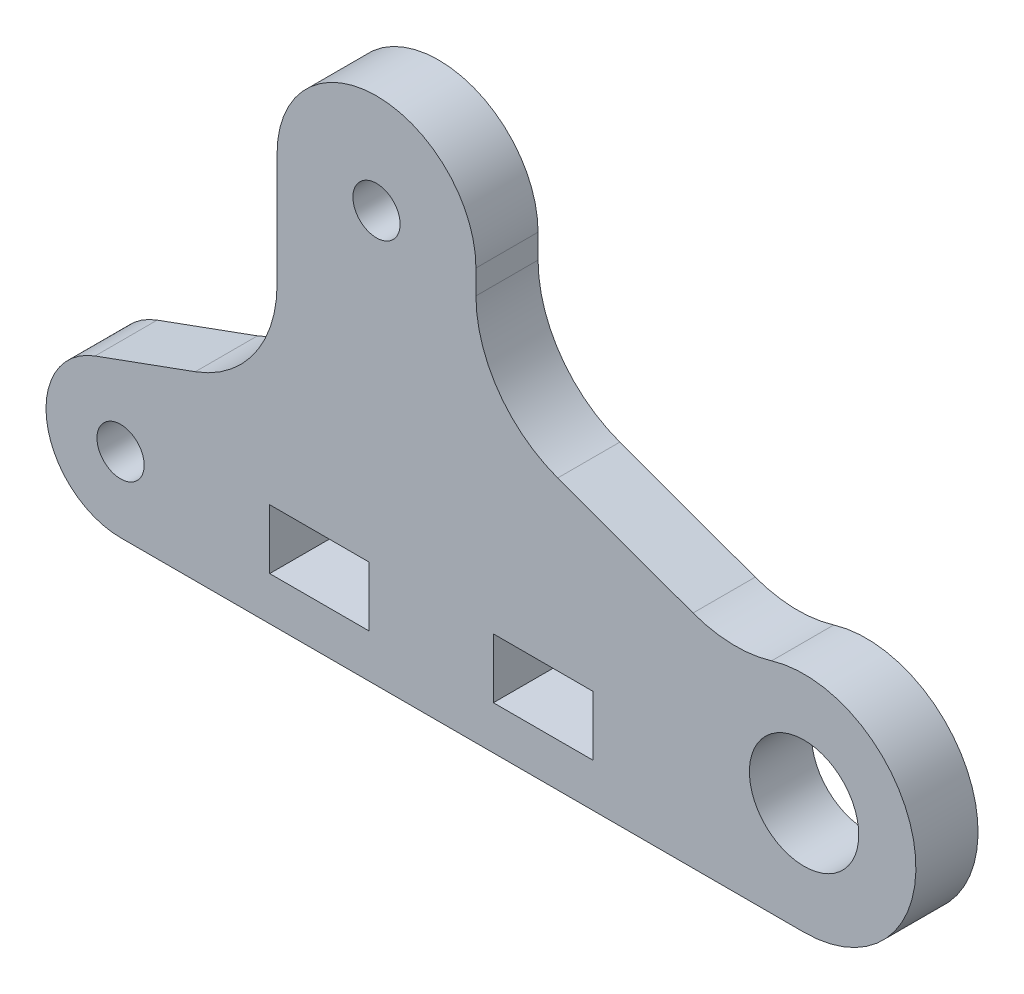
ISO-10303-21;
HEADER;
FILE_DESCRIPTION(('STEP AP214'),'2;1');
FILE_NAME('part.step','',(''),(''),'','','');
FILE_SCHEMA(('AUTOMOTIVE_DESIGN { 1 0 10303 214 1 1 1 1 }'));
ENDSEC;
DATA;
#1=APPLICATION_CONTEXT('core data for automotive mechanical design processes');
#2=APPLICATION_PROTOCOL_DEFINITION('international standard','automotive_design',2000,#1);
#3=PRODUCT_CONTEXT('',#1,'mechanical');
#4=PRODUCT('Part','Part','',(#3));
#5=PRODUCT_RELATED_PRODUCT_CATEGORY('part','',(#4));
#6=PRODUCT_DEFINITION_FORMATION('','',#4);
#7=PRODUCT_DEFINITION_CONTEXT('part definition',#1,'design');
#8=PRODUCT_DEFINITION('design','',#6,#7);
#9=PRODUCT_DEFINITION_SHAPE('','',#8);
#10=(LENGTH_UNIT() NAMED_UNIT(*) SI_UNIT(.MILLI.,.METRE.));
#11=(NAMED_UNIT(*) PLANE_ANGLE_UNIT() SI_UNIT($,.RADIAN.));
#12=(NAMED_UNIT(*) SI_UNIT($,.STERADIAN.) SOLID_ANGLE_UNIT());
#13=UNCERTAINTY_MEASURE_WITH_UNIT(LENGTH_MEASURE(1.E-05),#10,'distance_accuracy_value','');
#14=(GEOMETRIC_REPRESENTATION_CONTEXT(3) GLOBAL_UNCERTAINTY_ASSIGNED_CONTEXT((#13)) GLOBAL_UNIT_ASSIGNED_CONTEXT((#10,
#11,#12)) REPRESENTATION_CONTEXT('',''));
#15=CARTESIAN_POINT('',(0.,0.,0.));
#16=DIRECTION('',(0.,0.,1.));
#17=DIRECTION('',(1.,0.,0.));
#18=AXIS2_PLACEMENT_3D('',#15,#16,#17);
#19=CARTESIAN_POINT('',(-55.,-3.00000000000001,5.));
#20=DIRECTION('',(0.,0.,1.));
#21=DIRECTION('',(1.,0.,0.));
#22=AXIS2_PLACEMENT_3D('',#19,#20,#21);
#23=PLANE('',#22);
#24=CARTESIAN_POINT('',(-52.4043858601376,14.971570646165,5.));
#25=DIRECTION('',(0.,0.,1.));
#26=DIRECTION('',(1.,0.,0.));
#27=AXIS2_PLACEMENT_3D('',#24,#25,#26);
#28=CIRCLE('',#27,10.);
#29=CARTESIAN_POINT('',(-42.4043858601376,14.971570646165,5.));
#30=VERTEX_POINT('',#29);
#31=CARTESIAN_POINT('',(-48.9841844268809,5.57464443830594,5.));
#32=VERTEX_POINT('',#31);
#33=EDGE_CURVE('E218',#30,#32,#28,.F.);
#34=ORIENTED_EDGE('',*,*,#33,.T.);
#35=DIRECTION('',(0.939692620785907,0.342020143325673,0.));
#36=VECTOR('',#35,1.);
#37=CARTESIAN_POINT('',(-57.052120859954,2.63815572471544,5.));
#38=LINE('',#37,#36);
#39=CARTESIAN_POINT('',(-57.052120859954,2.63815572471543,5.));
#40=VERTEX_POINT('',#39);
#41=EDGE_CURVE('E168',#32,#40,#38,.F.);
#42=ORIENTED_EDGE('',*,*,#41,.T.);
#43=CARTESIAN_POINT('',(-55.,-3.00000000000001,5.));
#44=DIRECTION('',(0.,0.,-1.));
#45=DIRECTION('',(-1.,0.,0.));
#46=AXIS2_PLACEMENT_3D('',#43,#44,#45);
#47=CIRCLE('',#46,6.);
#48=CARTESIAN_POINT('',(-55.,-9.00000000000001,5.));
#49=VERTEX_POINT('',#48);
#50=EDGE_CURVE('E108',#49,#40,#47,.T.);
#51=ORIENTED_EDGE('',*,*,#50,.F.);
#52=DIRECTION('',(-1.,0.,0.));
#53=VECTOR('',#52,1.);
#54=CARTESIAN_POINT('',(0.,-9.,5.));
#55=LINE('',#54,#53);
#56=CARTESIAN_POINT('',(0.,-9.,5.));
#57=VERTEX_POINT('',#56);
#58=EDGE_CURVE('E184',#49,#57,#55,.F.);
#59=ORIENTED_EDGE('',*,*,#58,.T.);
#60=CARTESIAN_POINT('',(0.,0.,5.));
#61=DIRECTION('',(0.,0.,-1.));
#62=DIRECTION('',(-1.,0.,0.));
#63=AXIS2_PLACEMENT_3D('',#60,#61,#62);
#64=CIRCLE('',#63,9.);
#65=CARTESIAN_POINT('',(-2.61173540827363,8.61271375102933,5.));
#66=VERTEX_POINT('',#65);
#67=EDGE_CURVE('E102',#66,#57,#64,.T.);
#68=ORIENTED_EDGE('',*,*,#67,.F.);
#69=CARTESIAN_POINT('',(-5.51366363968878,18.1823956966175,5.));
#70=DIRECTION('',(0.,0.,-1.));
#71=DIRECTION('',(-1.,0.,0.));
#72=AXIS2_PLACEMENT_3D('',#69,#70,#71);
#73=CIRCLE('',#72,10.);
#74=CARTESIAN_POINT('',(-8.93386507294544,8.78546948875838,5.));
#75=VERTEX_POINT('',#74);
#76=EDGE_CURVE('E224',#66,#75,#73,.T.);
#77=ORIENTED_EDGE('',*,*,#76,.T.);
#78=DIRECTION('',(0.93969262078591,-0.342020143325666,0.));
#79=VECTOR('',#78,1.);
#80=CARTESIAN_POINT('',(-26.4043858601376,15.1442190324252,5.));
#81=LINE('',#80,#79);
#82=CARTESIAN_POINT('',(-19.8245872933943,12.7493682066632,5.));
#83=VERTEX_POINT('',#82);
#84=EDGE_CURVE('E180',#75,#83,#81,.F.);
#85=ORIENTED_EDGE('',*,*,#84,.T.);
#86=CARTESIAN_POINT('',(-16.4043858601376,22.1462944145223,5.));
#87=DIRECTION('',(0.,0.,1.));
#88=DIRECTION('',(1.,0.,0.));
#89=AXIS2_PLACEMENT_3D('',#86,#87,#88);
#90=CIRCLE('',#89,10.);
#91=CARTESIAN_POINT('',(-26.4043858601376,22.1462944145223,5.));
#92=VERTEX_POINT('',#91);
#93=EDGE_CURVE('E222',#83,#92,#90,.F.);
#94=ORIENTED_EDGE('',*,*,#93,.T.);
#95=DIRECTION('',(0.,1.,0.));
#96=VECTOR('',#95,1.);
#97=CARTESIAN_POINT('',(-26.4043858601376,24.090210326744,5.));
#98=LINE('',#97,#96);
#99=CARTESIAN_POINT('',(-26.4043858601376,24.090210326744,5.));
#100=VERTEX_POINT('',#99);
#101=EDGE_CURVE('E175',#92,#100,#98,.T.);
#102=ORIENTED_EDGE('',*,*,#101,.T.);
#103=CARTESIAN_POINT('',(-34.4043858601376,24.090210326744,5.));
#104=DIRECTION('',(0.,0.,-1.));
#105=DIRECTION('',(-1.,0.,0.));
#106=AXIS2_PLACEMENT_3D('',#103,#104,#105);
#107=CIRCLE('',#106,8.);
#108=CARTESIAN_POINT('',(-42.4043858601376,24.090210326744,5.));
#109=VERTEX_POINT('',#108);
#110=EDGE_CURVE('E178',#109,#100,#107,.T.);
#111=ORIENTED_EDGE('',*,*,#110,.F.);
#112=DIRECTION('',(0.,1.,0.));
#113=VECTOR('',#112,1.);
#114=CARTESIAN_POINT('',(-42.4043858601376,24.090210326744,5.));
#115=LINE('',#114,#113);
#116=EDGE_CURVE('E171',#109,#30,#115,.F.);
#117=ORIENTED_EDGE('',*,*,#116,.T.);
#118=EDGE_LOOP('',(#34,#42,#51,#59,#68,#77,#85,#94,#102,#111,#117));
#119=FACE_BOUND('',#118,.T.);
#120=CARTESIAN_POINT('',(-34.4043858601376,24.090210326744,5.));
#121=DIRECTION('',(0.,0.,1.));
#122=DIRECTION('',(1.,0.,0.));
#123=AXIS2_PLACEMENT_3D('',#120,#121,#122);
#124=CIRCLE('',#123,1.9);
#125=CARTESIAN_POINT('',(-32.5043858601376,24.090210326744,5.));
#126=VERTEX_POINT('',#125);
#127=EDGE_CURVE('E229',#126,#126,#124,.F.);
#128=ORIENTED_EDGE('',*,*,#127,.T.);
#129=EDGE_LOOP('',(#128));
#130=FACE_BOUND('',#129,.T.);
#131=CARTESIAN_POINT('',(-55.,-3.00000000000001,5.));
#132=DIRECTION('',(0.,0.,1.));
#133=DIRECTION('',(1.,0.,0.));
#134=AXIS2_PLACEMENT_3D('',#131,#132,#133);
#135=CIRCLE('',#134,1.9);
#136=CARTESIAN_POINT('',(-53.1,-3.00000000000001,5.));
#137=VERTEX_POINT('',#136);
#138=EDGE_CURVE('E231',#137,#137,#135,.F.);
#139=ORIENTED_EDGE('',*,*,#138,.T.);
#140=EDGE_LOOP('',(#139));
#141=FACE_BOUND('',#140,.T.);
#142=CARTESIAN_POINT('',(0.,0.,5.));
#143=DIRECTION('',(0.,0.,1.));
#144=DIRECTION('',(1.,0.,0.));
#145=AXIS2_PLACEMENT_3D('',#142,#143,#144);
#146=CIRCLE('',#145,4.4);
#147=CARTESIAN_POINT('',(4.4,0.,5.));
#148=VERTEX_POINT('',#147);
#149=EDGE_CURVE('E20',#148,#148,#146,.F.);
#150=ORIENTED_EDGE('',*,*,#149,.T.);
#151=EDGE_LOOP('',(#150));
#152=FACE_BOUND('',#151,.T.);
#153=DIRECTION('',(0.,1.,0.));
#154=VECTOR('',#153,1.);
#155=CARTESIAN_POINT('',(-17.,-0.700000000000009,5.));
#156=LINE('',#155,#154);
#157=CARTESIAN_POINT('',(-17.,-0.700000000000009,5.));
#158=VERTEX_POINT('',#157);
#159=CARTESIAN_POINT('',(-17.,-5.50000000000001,5.));
#160=VERTEX_POINT('',#159);
#161=EDGE_CURVE('E258',#158,#160,#156,.F.);
#162=ORIENTED_EDGE('',*,*,#161,.T.);
#163=DIRECTION('',(1.,0.,0.));
#164=VECTOR('',#163,1.);
#165=CARTESIAN_POINT('',(-43.,-5.50000000000001,5.));
#166=LINE('',#165,#164);
#167=CARTESIAN_POINT('',(-25.,-5.50000000000001,5.));
#168=VERTEX_POINT('',#167);
#169=EDGE_CURVE('E253',#160,#168,#166,.F.);
#170=ORIENTED_EDGE('',*,*,#169,.T.);
#171=DIRECTION('',(0.,1.,0.));
#172=VECTOR('',#171,1.);
#173=CARTESIAN_POINT('',(-25.,-0.700000000000009,5.));
#174=LINE('',#173,#172);
#175=CARTESIAN_POINT('',(-25.,-0.700000000000009,5.));
#176=VERTEX_POINT('',#175);
#177=EDGE_CURVE('E117',#176,#168,#174,.F.);
#178=ORIENTED_EDGE('',*,*,#177,.F.);
#179=DIRECTION('',(1.,0.,0.));
#180=VECTOR('',#179,1.);
#181=CARTESIAN_POINT('',(-43.,-0.700000000000009,5.));
#182=LINE('',#181,#180);
#183=EDGE_CURVE('E236',#176,#158,#182,.T.);
#184=ORIENTED_EDGE('',*,*,#183,.T.);
#185=EDGE_LOOP('',(#162,#170,#178,#184));
#186=FACE_BOUND('',#185,.T.);
#187=DIRECTION('',(1.,0.,0.));
#188=VECTOR('',#187,1.);
#189=CARTESIAN_POINT('',(-43.,-5.50000000000001,5.));
#190=LINE('',#189,#188);
#191=CARTESIAN_POINT('',(-35.,-5.50000000000001,5.));
#192=VERTEX_POINT('',#191);
#193=CARTESIAN_POINT('',(-43.,-5.50000000000001,5.));
#194=VERTEX_POINT('',#193);
#195=EDGE_CURVE('E144',#192,#194,#190,.F.);
#196=ORIENTED_EDGE('',*,*,#195,.T.);
#197=DIRECTION('',(0.,1.,0.));
#198=VECTOR('',#197,1.);
#199=CARTESIAN_POINT('',(-43.,-0.700000000000009,5.));
#200=LINE('',#199,#198);
#201=CARTESIAN_POINT('',(-43.,-0.700000000000009,5.));
#202=VERTEX_POINT('',#201);
#203=EDGE_CURVE('E141',#194,#202,#200,.T.);
#204=ORIENTED_EDGE('',*,*,#203,.T.);
#205=DIRECTION('',(1.,0.,0.));
#206=VECTOR('',#205,1.);
#207=CARTESIAN_POINT('',(-43.,-0.700000000000009,5.));
#208=LINE('',#207,#206);
#209=CARTESIAN_POINT('',(-35.,-0.700000000000009,5.));
#210=VERTEX_POINT('',#209);
#211=EDGE_CURVE('E266',#202,#210,#208,.T.);
#212=ORIENTED_EDGE('',*,*,#211,.T.);
#213=DIRECTION('',(0.,1.,0.));
#214=VECTOR('',#213,1.);
#215=CARTESIAN_POINT('',(-35.,-0.700000000000009,5.));
#216=LINE('',#215,#214);
#217=EDGE_CURVE('E145',#192,#210,#216,.T.);
#218=ORIENTED_EDGE('',*,*,#217,.F.);
#219=EDGE_LOOP('',(#196,#204,#212,#218));
#220=FACE_BOUND('',#219,.T.);
#221=ADVANCED_FACE('F17',(#119,#130,#141,#152,#186,#220),#23,.T.);
#222=CARTESIAN_POINT('',(-43.,-5.50000000000001,-3.));
#223=DIRECTION('',(0.,-1.,0.));
#224=DIRECTION('',(0.,0.,-1.));
#225=AXIS2_PLACEMENT_3D('',#222,#223,#224);
#226=PLANE('',#225);
#227=DIRECTION('',(0.,0.,1.));
#228=VECTOR('',#227,1.);
#229=CARTESIAN_POINT('',(-35.,-5.50000000000001,0.));
#230=LINE('',#229,#228);
#231=CARTESIAN_POINT('',(-35.,-5.50000000000001,0.));
#232=VERTEX_POINT('',#231);
#233=EDGE_CURVE('E260',#232,#192,#230,.T.);
#234=ORIENTED_EDGE('',*,*,#233,.F.);
#235=DIRECTION('',(1.,0.,0.));
#236=VECTOR('',#235,1.);
#237=CARTESIAN_POINT('',(-55.,-5.50000000000001,0.));
#238=LINE('',#237,#236);
#239=CARTESIAN_POINT('',(-43.,-5.50000000000001,0.));
#240=VERTEX_POINT('',#239);
#241=EDGE_CURVE('E164',#232,#240,#238,.F.);
#242=ORIENTED_EDGE('',*,*,#241,.T.);
#243=DIRECTION('',(0.,0.,1.));
#244=VECTOR('',#243,1.);
#245=CARTESIAN_POINT('',(-43.,-5.50000000000001,-3.));
#246=LINE('',#245,#244);
#247=EDGE_CURVE('E150',#240,#194,#246,.T.);
#248=ORIENTED_EDGE('',*,*,#247,.T.);
#249=ORIENTED_EDGE('',*,*,#195,.F.);
#250=EDGE_LOOP('',(#234,#242,#248,#249));
#251=FACE_BOUND('',#250,.T.);
#252=ADVANCED_FACE('F162',(#251),#226,.F.);
#253=CARTESIAN_POINT('',(-43.,-0.700000000000009,-3.));
#254=DIRECTION('',(-1.,0.,0.));
#255=DIRECTION('',(0.,0.,1.));
#256=AXIS2_PLACEMENT_3D('',#253,#254,#255);
#257=PLANE('',#256);
#258=ORIENTED_EDGE('',*,*,#203,.F.);
#259=ORIENTED_EDGE('',*,*,#247,.F.);
#260=DIRECTION('',(0.,1.,0.));
#261=VECTOR('',#260,1.);
#262=CARTESIAN_POINT('',(-43.,-3.00000000000001,0.));
#263=LINE('',#262,#261);
#264=CARTESIAN_POINT('',(-43.,-0.700000000000009,0.));
#265=VERTEX_POINT('',#264);
#266=EDGE_CURVE('E289',#240,#265,#263,.T.);
#267=ORIENTED_EDGE('',*,*,#266,.T.);
#268=DIRECTION('',(0.,0.,1.));
#269=VECTOR('',#268,1.);
#270=CARTESIAN_POINT('',(-43.,-0.700000000000009,-3.));
#271=LINE('',#270,#269);
#272=EDGE_CURVE('E159',#265,#202,#271,.T.);
#273=ORIENTED_EDGE('',*,*,#272,.T.);
#274=EDGE_LOOP('',(#258,#259,#267,#273));
#275=FACE_BOUND('',#274,.T.);
#276=ADVANCED_FACE('F155',(#275),#257,.F.);
#277=CARTESIAN_POINT('',(-43.,-0.700000000000009,-3.));
#278=DIRECTION('',(0.,1.,0.));
#279=DIRECTION('',(0.,0.,1.));
#280=AXIS2_PLACEMENT_3D('',#277,#278,#279);
#281=PLANE('',#280);
#282=DIRECTION('',(0.,0.,1.));
#283=VECTOR('',#282,1.);
#284=CARTESIAN_POINT('',(-35.,-0.700000000000009,0.));
#285=LINE('',#284,#283);
#286=CARTESIAN_POINT('',(-35.,-0.700000000000009,0.));
#287=VERTEX_POINT('',#286);
#288=EDGE_CURVE('E262',#210,#287,#285,.F.);
#289=ORIENTED_EDGE('',*,*,#288,.F.);
#290=ORIENTED_EDGE('',*,*,#211,.F.);
#291=ORIENTED_EDGE('',*,*,#272,.F.);
#292=DIRECTION('',(1.,0.,0.));
#293=VECTOR('',#292,1.);
#294=CARTESIAN_POINT('',(-55.,-0.700000000000009,0.));
#295=LINE('',#294,#293);
#296=EDGE_CURVE('E273',#265,#287,#295,.T.);
#297=ORIENTED_EDGE('',*,*,#296,.T.);
#298=EDGE_LOOP('',(#289,#290,#291,#297));
#299=FACE_BOUND('',#298,.T.);
#300=ADVANCED_FACE('F270',(#299),#281,.F.);
#301=CARTESIAN_POINT('',(-35.,-0.700000000000009,0.));
#302=DIRECTION('',(-1.,0.,0.));
#303=DIRECTION('',(0.,0.,1.));
#304=AXIS2_PLACEMENT_3D('',#301,#302,#303);
#305=PLANE('',#304);
#306=DIRECTION('',(0.,1.,0.));
#307=VECTOR('',#306,1.);
#308=CARTESIAN_POINT('',(-35.,-3.00000000000001,0.));
#309=LINE('',#308,#307);
#310=EDGE_CURVE('E278',#287,#232,#309,.F.);
#311=ORIENTED_EDGE('',*,*,#310,.T.);
#312=ORIENTED_EDGE('',*,*,#233,.T.);
#313=ORIENTED_EDGE('',*,*,#217,.T.);
#314=ORIENTED_EDGE('',*,*,#288,.T.);
#315=EDGE_LOOP('',(#311,#312,#313,#314));
#316=FACE_BOUND('',#315,.T.);
#317=ADVANCED_FACE('F277',(#316),#305,.T.);
#318=CARTESIAN_POINT('',(-17.,-0.700000000000009,-3.));
#319=DIRECTION('',(1.,0.,0.));
#320=DIRECTION('',(0.,0.,-1.));
#321=AXIS2_PLACEMENT_3D('',#318,#319,#320);
#322=PLANE('',#321);
#323=ORIENTED_EDGE('',*,*,#161,.F.);
#324=DIRECTION('',(0.,0.,1.));
#325=VECTOR('',#324,1.);
#326=CARTESIAN_POINT('',(-17.,-0.700000000000009,-3.));
#327=LINE('',#326,#325);
#328=CARTESIAN_POINT('',(-17.,-0.700000000000009,0.));
#329=VERTEX_POINT('',#328);
#330=EDGE_CURVE('E242',#158,#329,#327,.F.);
#331=ORIENTED_EDGE('',*,*,#330,.T.);
#332=DIRECTION('',(0.,1.,0.));
#333=VECTOR('',#332,1.);
#334=CARTESIAN_POINT('',(-17.,-3.00000000000001,0.));
#335=LINE('',#334,#333);
#336=CARTESIAN_POINT('',(-17.,-5.50000000000001,0.));
#337=VERTEX_POINT('',#336);
#338=EDGE_CURVE('E284',#329,#337,#335,.F.);
#339=ORIENTED_EDGE('',*,*,#338,.T.);
#340=DIRECTION('',(0.,0.,-1.));
#341=VECTOR('',#340,1.);
#342=CARTESIAN_POINT('',(-17.,-5.50000000000001,-3.));
#343=LINE('',#342,#341);
#344=EDGE_CURVE('E255',#337,#160,#343,.F.);
#345=ORIENTED_EDGE('',*,*,#344,.T.);
#346=EDGE_LOOP('',(#323,#331,#339,#345));
#347=FACE_BOUND('',#346,.T.);
#348=ADVANCED_FACE('F343',(#347),#322,.F.);
#349=CARTESIAN_POINT('',(-43.,-5.50000000000001,-3.));
#350=DIRECTION('',(0.,-1.,0.));
#351=DIRECTION('',(0.,0.,-1.));
#352=AXIS2_PLACEMENT_3D('',#349,#350,#351);
#353=PLANE('',#352);
#354=DIRECTION('',(0.,0.,-1.));
#355=VECTOR('',#354,1.);
#356=CARTESIAN_POINT('',(-25.,-5.50000000000001,0.));
#357=LINE('',#356,#355);
#358=CARTESIAN_POINT('',(-25.,-5.50000000000001,0.));
#359=VERTEX_POINT('',#358);
#360=EDGE_CURVE('E249',#168,#359,#357,.T.);
#361=ORIENTED_EDGE('',*,*,#360,.F.);
#362=ORIENTED_EDGE('',*,*,#169,.F.);
#363=ORIENTED_EDGE('',*,*,#344,.F.);
#364=DIRECTION('',(1.,0.,0.));
#365=VECTOR('',#364,1.);
#366=CARTESIAN_POINT('',(-55.,-5.50000000000001,0.));
#367=LINE('',#366,#365);
#368=EDGE_CURVE('E287',#337,#359,#367,.F.);
#369=ORIENTED_EDGE('',*,*,#368,.T.);
#370=EDGE_LOOP('',(#361,#362,#363,#369));
#371=FACE_BOUND('',#370,.T.);
#372=ADVANCED_FACE('F333',(#371),#353,.F.);
#373=CARTESIAN_POINT('',(-25.,-0.700000000000009,0.));
#374=DIRECTION('',(1.,0.,0.));
#375=DIRECTION('',(0.,0.,-1.));
#376=AXIS2_PLACEMENT_3D('',#373,#374,#375);
#377=PLANE('',#376);
#378=DIRECTION('',(0.,1.,0.));
#379=VECTOR('',#378,1.);
#380=CARTESIAN_POINT('',(-25.,-3.00000000000001,0.));
#381=LINE('',#380,#379);
#382=CARTESIAN_POINT('',(-25.,-0.700000000000009,0.));
#383=VERTEX_POINT('',#382);
#384=EDGE_CURVE('E325',#359,#383,#381,.T.);
#385=ORIENTED_EDGE('',*,*,#384,.T.);
#386=DIRECTION('',(0.,0.,1.));
#387=VECTOR('',#386,1.);
#388=CARTESIAN_POINT('',(-25.,-0.700000000000009,-3.));
#389=LINE('',#388,#387);
#390=EDGE_CURVE('E239',#383,#176,#389,.T.);
#391=ORIENTED_EDGE('',*,*,#390,.T.);
#392=ORIENTED_EDGE('',*,*,#177,.T.);
#393=ORIENTED_EDGE('',*,*,#360,.T.);
#394=EDGE_LOOP('',(#385,#391,#392,#393));
#395=FACE_BOUND('',#394,.T.);
#396=ADVANCED_FACE('F351',(#395),#377,.T.);
#397=CARTESIAN_POINT('',(-43.,-0.700000000000009,-3.));
#398=DIRECTION('',(0.,1.,0.));
#399=DIRECTION('',(0.,0.,1.));
#400=AXIS2_PLACEMENT_3D('',#397,#398,#399);
#401=PLANE('',#400);
#402=ORIENTED_EDGE('',*,*,#390,.F.);
#403=DIRECTION('',(1.,0.,0.));
#404=VECTOR('',#403,1.);
#405=CARTESIAN_POINT('',(-55.,-0.700000000000009,0.));
#406=LINE('',#405,#404);
#407=EDGE_CURVE('E215',#383,#329,#406,.T.);
#408=ORIENTED_EDGE('',*,*,#407,.T.);
#409=ORIENTED_EDGE('',*,*,#330,.F.);
#410=ORIENTED_EDGE('',*,*,#183,.F.);
#411=EDGE_LOOP('',(#402,#408,#409,#410));
#412=FACE_BOUND('',#411,.T.);
#413=ADVANCED_FACE('F348',(#412),#401,.F.);
#414=CARTESIAN_POINT('',(0.,0.,0.));
#415=DIRECTION('',(0.,0.,1.));
#416=DIRECTION('',(1.,0.,0.));
#417=AXIS2_PLACEMENT_3D('',#414,#415,#416);
#418=CYLINDRICAL_SURFACE('',#417,4.4);
#419=CARTESIAN_POINT('',(0.,0.,0.));
#420=DIRECTION('',(0.,0.,1.));
#421=DIRECTION('',(1.,0.,0.));
#422=AXIS2_PLACEMENT_3D('',#419,#420,#421);
#423=CIRCLE('',#422,4.4);
#424=CARTESIAN_POINT('',(4.4,0.,0.));
#425=VERTEX_POINT('',#424);
#426=EDGE_CURVE('E212',#425,#425,#423,.F.);
#427=ORIENTED_EDGE('',*,*,#426,.T.);
#428=EDGE_LOOP('',(#427));
#429=FACE_BOUND('',#428,.T.);
#430=ORIENTED_EDGE('',*,*,#149,.F.);
#431=EDGE_LOOP('',(#430));
#432=FACE_BOUND('',#431,.T.);
#433=ADVANCED_FACE('F410',(#429,#432),#418,.F.);
#434=CARTESIAN_POINT('',(-55.,-3.00000000000001,0.));
#435=DIRECTION('',(0.,0.,1.));
#436=DIRECTION('',(1.,0.,0.));
#437=AXIS2_PLACEMENT_3D('',#434,#435,#436);
#438=CYLINDRICAL_SURFACE('',#437,1.9);
#439=CARTESIAN_POINT('',(-55.,-3.00000000000001,0.));
#440=DIRECTION('',(0.,0.,1.));
#441=DIRECTION('',(1.,0.,0.));
#442=AXIS2_PLACEMENT_3D('',#439,#440,#441);
#443=CIRCLE('',#442,1.9);
#444=CARTESIAN_POINT('',(-53.1,-3.00000000000001,0.));
#445=VERTEX_POINT('',#444);
#446=EDGE_CURVE('E209',#445,#445,#443,.F.);
#447=ORIENTED_EDGE('',*,*,#446,.T.);
#448=EDGE_LOOP('',(#447));
#449=FACE_BOUND('',#448,.T.);
#450=ORIENTED_EDGE('',*,*,#138,.F.);
#451=EDGE_LOOP('',(#450));
#452=FACE_BOUND('',#451,.T.);
#453=ADVANCED_FACE('F406',(#449,#452),#438,.F.);
#454=CARTESIAN_POINT('',(-34.4043858601376,24.090210326744,0.));
#455=DIRECTION('',(0.,0.,1.));
#456=DIRECTION('',(1.,0.,0.));
#457=AXIS2_PLACEMENT_3D('',#454,#455,#456);
#458=CYLINDRICAL_SURFACE('',#457,1.9);
#459=CARTESIAN_POINT('',(-34.4043858601376,24.090210326744,0.));
#460=DIRECTION('',(0.,0.,1.));
#461=DIRECTION('',(1.,0.,0.));
#462=AXIS2_PLACEMENT_3D('',#459,#460,#461);
#463=CIRCLE('',#462,1.9);
#464=CARTESIAN_POINT('',(-32.5043858601376,24.090210326744,0.));
#465=VERTEX_POINT('',#464);
#466=EDGE_CURVE('E206',#465,#465,#463,.F.);
#467=ORIENTED_EDGE('',*,*,#466,.T.);
#468=EDGE_LOOP('',(#467));
#469=FACE_BOUND('',#468,.T.);
#470=ORIENTED_EDGE('',*,*,#127,.F.);
#471=EDGE_LOOP('',(#470));
#472=FACE_BOUND('',#471,.T.);
#473=ADVANCED_FACE('F403',(#469,#472),#458,.F.);
#474=CARTESIAN_POINT('',(0.,-9.,5.));
#475=DIRECTION('',(0.,1.,0.));
#476=DIRECTION('',(-1.,0.,0.));
#477=AXIS2_PLACEMENT_3D('',#474,#475,#476);
#478=PLANE('',#477);
#479=DIRECTION('',(0.,0.,-1.));
#480=VECTOR('',#479,1.);
#481=CARTESIAN_POINT('',(0.,-9.,5.));
#482=LINE('',#481,#480);
#483=CARTESIAN_POINT('',(0.,-9.00000000000001,0.));
#484=VERTEX_POINT('',#483);
#485=EDGE_CURVE('E228',#57,#484,#482,.T.);
#486=ORIENTED_EDGE('',*,*,#485,.F.);
#487=ORIENTED_EDGE('',*,*,#58,.F.);
#488=DIRECTION('',(0.,0.,1.));
#489=VECTOR('',#488,1.);
#490=CARTESIAN_POINT('',(-55.,-9.00000000000001,5.));
#491=LINE('',#490,#489);
#492=CARTESIAN_POINT('',(-55.,-9.00000000000001,0.));
#493=VERTEX_POINT('',#492);
#494=EDGE_CURVE('E186',#493,#49,#491,.T.);
#495=ORIENTED_EDGE('',*,*,#494,.F.);
#496=DIRECTION('',(1.,0.,0.));
#497=VECTOR('',#496,1.);
#498=CARTESIAN_POINT('',(-55.,-9.00000000000001,0.));
#499=LINE('',#498,#497);
#500=EDGE_CURVE('E204',#493,#484,#499,.T.);
#501=ORIENTED_EDGE('',*,*,#500,.T.);
#502=EDGE_LOOP('',(#486,#487,#495,#501));
#503=FACE_BOUND('',#502,.T.);
#504=ADVANCED_FACE('F317',(#503),#478,.F.);
#505=CARTESIAN_POINT('',(0.,0.,5.));
#506=DIRECTION('',(0.,0.,-1.));
#507=DIRECTION('',(-1.,0.,0.));
#508=AXIS2_PLACEMENT_3D('',#505,#506,#507);
#509=CYLINDRICAL_SURFACE('',#508,9.);
#510=ORIENTED_EDGE('',*,*,#67,.T.);
#511=ORIENTED_EDGE('',*,*,#485,.T.);
#512=CARTESIAN_POINT('',(0.,0.,0.));
#513=DIRECTION('',(0.,0.,-1.));
#514=DIRECTION('',(-1.,0.,0.));
#515=AXIS2_PLACEMENT_3D('',#512,#513,#514);
#516=CIRCLE('',#515,9.);
#517=CARTESIAN_POINT('',(-2.61173540827363,8.61271375102933,0.));
#518=VERTEX_POINT('',#517);
#519=EDGE_CURVE('E201',#484,#518,#516,.F.);
#520=ORIENTED_EDGE('',*,*,#519,.T.);
#521=DIRECTION('',(0.,0.,-1.));
#522=VECTOR('',#521,1.);
#523=CARTESIAN_POINT('',(-2.61173540827363,8.61271375102933,5.));
#524=LINE('',#523,#522);
#525=EDGE_CURVE('E226',#518,#66,#524,.F.);
#526=ORIENTED_EDGE('',*,*,#525,.T.);
#527=EDGE_LOOP('',(#510,#511,#520,#526));
#528=FACE_BOUND('',#527,.T.);
#529=ADVANCED_FACE('F311',(#528),#509,.T.);
#530=CARTESIAN_POINT('',(-5.51366363968878,18.1823956966175,5.));
#531=DIRECTION('',(0.,0.,-1.));
#532=DIRECTION('',(-1.,0.,0.));
#533=AXIS2_PLACEMENT_3D('',#530,#531,#532);
#534=CYLINDRICAL_SURFACE('',#533,10.);
#535=ORIENTED_EDGE('',*,*,#525,.F.);
#536=CARTESIAN_POINT('',(-5.51366363968878,18.1823956966175,0.));
#537=DIRECTION('',(0.,0.,-1.));
#538=DIRECTION('',(-1.,0.,0.));
#539=AXIS2_PLACEMENT_3D('',#536,#537,#538);
#540=CIRCLE('',#539,10.);
#541=CARTESIAN_POINT('',(-8.93386507294544,8.78546948875838,0.));
#542=VERTEX_POINT('',#541);
#543=EDGE_CURVE('E198',#518,#542,#540,.T.);
#544=ORIENTED_EDGE('',*,*,#543,.T.);
#545=DIRECTION('',(0.,0.,1.));
#546=VECTOR('',#545,1.);
#547=CARTESIAN_POINT('',(-8.93386507294544,8.78546948875838,5.));
#548=LINE('',#547,#546);
#549=EDGE_CURVE('E183',#542,#75,#548,.T.);
#550=ORIENTED_EDGE('',*,*,#549,.T.);
#551=ORIENTED_EDGE('',*,*,#76,.F.);
#552=EDGE_LOOP('',(#535,#544,#550,#551));
#553=FACE_BOUND('',#552,.T.);
#554=ADVANCED_FACE('F394',(#553),#534,.F.);
#555=CARTESIAN_POINT('',(-26.4043858601376,15.1442190324252,5.));
#556=DIRECTION('',(-0.342020143325666,-0.93969262078591,0.));
#557=DIRECTION('',(0.93969262078591,-0.342020143325666,0.));
#558=AXIS2_PLACEMENT_3D('',#555,#556,#557);
#559=PLANE('',#558);
#560=ORIENTED_EDGE('',*,*,#549,.F.);
#561=DIRECTION('',(-0.93969262078591,0.342020143325666,0.));
#562=VECTOR('',#561,1.);
#563=CARTESIAN_POINT('',(-8.93386507294545,8.78546948875838,0.));
#564=LINE('',#563,#562);
#565=CARTESIAN_POINT('',(-19.8245872933943,12.7493682066632,0.));
#566=VERTEX_POINT('',#565);
#567=EDGE_CURVE('E197',#542,#566,#564,.T.);
#568=ORIENTED_EDGE('',*,*,#567,.T.);
#569=DIRECTION('',(0.,0.,1.));
#570=VECTOR('',#569,1.);
#571=CARTESIAN_POINT('',(-19.8245872933943,12.7493682066632,5.));
#572=LINE('',#571,#570);
#573=EDGE_CURVE('E182',#566,#83,#572,.T.);
#574=ORIENTED_EDGE('',*,*,#573,.T.);
#575=ORIENTED_EDGE('',*,*,#84,.F.);
#576=EDGE_LOOP('',(#560,#568,#574,#575));
#577=FACE_BOUND('',#576,.T.);
#578=ADVANCED_FACE('F390',(#577),#559,.F.);
#579=CARTESIAN_POINT('',(-16.4043858601376,22.1462944145223,5.));
#580=DIRECTION('',(0.,0.,1.));
#581=DIRECTION('',(1.,0.,0.));
#582=AXIS2_PLACEMENT_3D('',#579,#580,#581);
#583=CYLINDRICAL_SURFACE('',#582,10.);
#584=ORIENTED_EDGE('',*,*,#573,.F.);
#585=CARTESIAN_POINT('',(-16.4043858601376,22.1462944145223,0.));
#586=DIRECTION('',(0.,0.,1.));
#587=DIRECTION('',(1.,0.,0.));
#588=AXIS2_PLACEMENT_3D('',#585,#586,#587);
#589=CIRCLE('',#588,10.);
#590=CARTESIAN_POINT('',(-26.4043858601376,22.1462944145223,0.));
#591=VERTEX_POINT('',#590);
#592=EDGE_CURVE('E194',#566,#591,#589,.F.);
#593=ORIENTED_EDGE('',*,*,#592,.T.);
#594=DIRECTION('',(0.,0.,1.));
#595=VECTOR('',#594,1.);
#596=CARTESIAN_POINT('',(-26.4043858601376,22.1462944145223,5.));
#597=LINE('',#596,#595);
#598=EDGE_CURVE('E179',#591,#92,#597,.T.);
#599=ORIENTED_EDGE('',*,*,#598,.T.);
#600=ORIENTED_EDGE('',*,*,#93,.F.);
#601=EDGE_LOOP('',(#584,#593,#599,#600));
#602=FACE_BOUND('',#601,.T.);
#603=ADVANCED_FACE('F386',(#602),#583,.F.);
#604=CARTESIAN_POINT('',(-26.4043858601376,24.090210326744,5.));
#605=DIRECTION('',(-1.,0.,0.));
#606=DIRECTION('',(0.,0.,1.));
#607=AXIS2_PLACEMENT_3D('',#604,#605,#606);
#608=PLANE('',#607);
#609=ORIENTED_EDGE('',*,*,#598,.F.);
#610=DIRECTION('',(0.,1.,0.));
#611=VECTOR('',#610,1.);
#612=CARTESIAN_POINT('',(-26.4043858601376,-3.00000000000001,0.));
#613=LINE('',#612,#611);
#614=CARTESIAN_POINT('',(-26.4043858601376,24.090210326744,0.));
#615=VERTEX_POINT('',#614);
#616=EDGE_CURVE('E193',#591,#615,#613,.T.);
#617=ORIENTED_EDGE('',*,*,#616,.T.);
#618=DIRECTION('',(0.,0.,-1.));
#619=VECTOR('',#618,1.);
#620=CARTESIAN_POINT('',(-26.4043858601376,24.090210326744,5.));
#621=LINE('',#620,#619);
#622=EDGE_CURVE('E221',#100,#615,#621,.T.);
#623=ORIENTED_EDGE('',*,*,#622,.F.);
#624=ORIENTED_EDGE('',*,*,#101,.F.);
#625=EDGE_LOOP('',(#609,#617,#623,#624));
#626=FACE_BOUND('',#625,.T.);
#627=ADVANCED_FACE('F382',(#626),#608,.F.);
#628=CARTESIAN_POINT('',(-34.4043858601376,24.090210326744,5.));
#629=DIRECTION('',(0.,0.,-1.));
#630=DIRECTION('',(-1.,0.,0.));
#631=AXIS2_PLACEMENT_3D('',#628,#629,#630);
#632=CYLINDRICAL_SURFACE('',#631,8.);
#633=ORIENTED_EDGE('',*,*,#110,.T.);
#634=ORIENTED_EDGE('',*,*,#622,.T.);
#635=CARTESIAN_POINT('',(-34.4043858601376,24.090210326744,0.));
#636=DIRECTION('',(0.,0.,-1.));
#637=DIRECTION('',(-1.,0.,0.));
#638=AXIS2_PLACEMENT_3D('',#635,#636,#637);
#639=CIRCLE('',#638,8.);
#640=CARTESIAN_POINT('',(-42.4043858601376,24.090210326744,0.));
#641=VERTEX_POINT('',#640);
#642=EDGE_CURVE('E190',#615,#641,#639,.F.);
#643=ORIENTED_EDGE('',*,*,#642,.T.);
#644=DIRECTION('',(0.,0.,1.));
#645=VECTOR('',#644,1.);
#646=CARTESIAN_POINT('',(-42.4043858601376,24.090210326744,5.));
#647=LINE('',#646,#645);
#648=EDGE_CURVE('E174',#641,#109,#647,.T.);
#649=ORIENTED_EDGE('',*,*,#648,.T.);
#650=EDGE_LOOP('',(#633,#634,#643,#649));
#651=FACE_BOUND('',#650,.T.);
#652=ADVANCED_FACE('F378',(#651),#632,.T.);
#653=CARTESIAN_POINT('',(-42.4043858601376,24.090210326744,5.));
#654=DIRECTION('',(1.,0.,0.));
#655=DIRECTION('',(0.,1.,0.));
#656=AXIS2_PLACEMENT_3D('',#653,#654,#655);
#657=PLANE('',#656);
#658=DIRECTION('',(0.,0.,1.));
#659=VECTOR('',#658,1.);
#660=CARTESIAN_POINT('',(-42.4043858601376,14.971570646165,5.));
#661=LINE('',#660,#659);
#662=CARTESIAN_POINT('',(-42.4043858601376,14.971570646165,0.));
#663=VERTEX_POINT('',#662);
#664=EDGE_CURVE('E173',#663,#30,#661,.T.);
#665=ORIENTED_EDGE('',*,*,#664,.T.);
#666=ORIENTED_EDGE('',*,*,#116,.F.);
#667=ORIENTED_EDGE('',*,*,#648,.F.);
#668=DIRECTION('',(0.,1.,0.));
#669=VECTOR('',#668,1.);
#670=CARTESIAN_POINT('',(-42.4043858601376,-3.00000000000001,0.));
#671=LINE('',#670,#669);
#672=EDGE_CURVE('E189',#641,#663,#671,.F.);
#673=ORIENTED_EDGE('',*,*,#672,.T.);
#674=EDGE_LOOP('',(#665,#666,#667,#673));
#675=FACE_BOUND('',#674,.T.);
#676=ADVANCED_FACE('F374',(#675),#657,.F.);
#677=CARTESIAN_POINT('',(-52.4043858601376,14.971570646165,5.));
#678=DIRECTION('',(0.,0.,1.));
#679=DIRECTION('',(1.,0.,0.));
#680=AXIS2_PLACEMENT_3D('',#677,#678,#679);
#681=CYLINDRICAL_SURFACE('',#680,10.);
#682=ORIENTED_EDGE('',*,*,#664,.F.);
#683=CARTESIAN_POINT('',(-52.4043858601376,14.971570646165,0.));
#684=DIRECTION('',(0.,0.,1.));
#685=DIRECTION('',(1.,0.,0.));
#686=AXIS2_PLACEMENT_3D('',#683,#684,#685);
#687=CIRCLE('',#686,10.);
#688=CARTESIAN_POINT('',(-48.9841844268809,5.57464443830594,0.));
#689=VERTEX_POINT('',#688);
#690=EDGE_CURVE('E26',#663,#689,#687,.F.);
#691=ORIENTED_EDGE('',*,*,#690,.T.);
#692=DIRECTION('',(0.,0.,1.));
#693=VECTOR('',#692,1.);
#694=CARTESIAN_POINT('',(-48.9841844268809,5.57464443830594,5.));
#695=LINE('',#694,#693);
#696=EDGE_CURVE('E170',#689,#32,#695,.T.);
#697=ORIENTED_EDGE('',*,*,#696,.T.);
#698=ORIENTED_EDGE('',*,*,#33,.F.);
#699=EDGE_LOOP('',(#682,#691,#697,#698));
#700=FACE_BOUND('',#699,.T.);
#701=ADVANCED_FACE('F370',(#700),#681,.F.);
#702=CARTESIAN_POINT('',(-57.052120859954,2.63815572471544,5.));
#703=DIRECTION('',(0.342020143325673,-0.939692620785907,0.));
#704=DIRECTION('',(0.939692620785907,0.342020143325673,0.));
#705=AXIS2_PLACEMENT_3D('',#702,#703,#704);
#706=PLANE('',#705);
#707=ORIENTED_EDGE('',*,*,#696,.F.);
#708=DIRECTION('',(-0.939692620785907,-0.342020143325673,0.));
#709=VECTOR('',#708,1.);
#710=CARTESIAN_POINT('',(-48.9841844268809,5.57464443830594,0.));
#711=LINE('',#710,#709);
#712=CARTESIAN_POINT('',(-57.052120859954,2.63815572471543,0.));
#713=VERTEX_POINT('',#712);
#714=EDGE_CURVE('E11',#689,#713,#711,.T.);
#715=ORIENTED_EDGE('',*,*,#714,.T.);
#716=DIRECTION('',(0.,0.,-1.));
#717=VECTOR('',#716,1.);
#718=CARTESIAN_POINT('',(-57.052120859954,2.63815572471543,5.));
#719=LINE('',#718,#717);
#720=EDGE_CURVE('E217',#40,#713,#719,.T.);
#721=ORIENTED_EDGE('',*,*,#720,.F.);
#722=ORIENTED_EDGE('',*,*,#41,.F.);
#723=EDGE_LOOP('',(#707,#715,#721,#722));
#724=FACE_BOUND('',#723,.T.);
#725=ADVANCED_FACE('F364',(#724),#706,.F.);
#726=CARTESIAN_POINT('',(-55.,-3.00000000000001,5.));
#727=DIRECTION('',(0.,0.,-1.));
#728=DIRECTION('',(-1.,0.,0.));
#729=AXIS2_PLACEMENT_3D('',#726,#727,#728);
#730=CYLINDRICAL_SURFACE('',#729,6.);
#731=ORIENTED_EDGE('',*,*,#720,.T.);
#732=CARTESIAN_POINT('',(-55.,-3.00000000000001,0.));
#733=DIRECTION('',(0.,0.,-1.));
#734=DIRECTION('',(-1.,0.,0.));
#735=AXIS2_PLACEMENT_3D('',#732,#733,#734);
#736=CIRCLE('',#735,6.);
#737=EDGE_CURVE('E35',#713,#493,#736,.F.);
#738=ORIENTED_EDGE('',*,*,#737,.T.);
#739=ORIENTED_EDGE('',*,*,#494,.T.);
#740=ORIENTED_EDGE('',*,*,#50,.T.);
#741=EDGE_LOOP('',(#731,#738,#739,#740));
#742=FACE_BOUND('',#741,.T.);
#743=ADVANCED_FACE('F359',(#742),#730,.T.);
#744=CARTESIAN_POINT('',(-55.,-3.00000000000001,0.));
#745=DIRECTION('',(0.,0.,1.));
#746=DIRECTION('',(1.,0.,0.));
#747=AXIS2_PLACEMENT_3D('',#744,#745,#746);
#748=PLANE('',#747);
#749=ORIENTED_EDGE('',*,*,#714,.F.);
#750=ORIENTED_EDGE('',*,*,#690,.F.);
#751=ORIENTED_EDGE('',*,*,#672,.F.);
#752=ORIENTED_EDGE('',*,*,#642,.F.);
#753=ORIENTED_EDGE('',*,*,#616,.F.);
#754=ORIENTED_EDGE('',*,*,#592,.F.);
#755=ORIENTED_EDGE('',*,*,#567,.F.);
#756=ORIENTED_EDGE('',*,*,#543,.F.);
#757=ORIENTED_EDGE('',*,*,#519,.F.);
#758=ORIENTED_EDGE('',*,*,#500,.F.);
#759=ORIENTED_EDGE('',*,*,#737,.F.);
#760=EDGE_LOOP('',(#749,#750,#751,#752,#753,#754,#755,#756,#757,#758,#759));
#761=FACE_BOUND('',#760,.T.);
#762=ORIENTED_EDGE('',*,*,#466,.F.);
#763=EDGE_LOOP('',(#762));
#764=FACE_BOUND('',#763,.T.);
#765=ORIENTED_EDGE('',*,*,#446,.F.);
#766=EDGE_LOOP('',(#765));
#767=FACE_BOUND('',#766,.T.);
#768=ORIENTED_EDGE('',*,*,#426,.F.);
#769=EDGE_LOOP('',(#768));
#770=FACE_BOUND('',#769,.T.);
#771=ORIENTED_EDGE('',*,*,#384,.F.);
#772=ORIENTED_EDGE('',*,*,#368,.F.);
#773=ORIENTED_EDGE('',*,*,#338,.F.);
#774=ORIENTED_EDGE('',*,*,#407,.F.);
#775=EDGE_LOOP('',(#771,#772,#773,#774));
#776=FACE_BOUND('',#775,.T.);
#777=ORIENTED_EDGE('',*,*,#296,.F.);
#778=ORIENTED_EDGE('',*,*,#266,.F.);
#779=ORIENTED_EDGE('',*,*,#241,.F.);
#780=ORIENTED_EDGE('',*,*,#310,.F.);
#781=EDGE_LOOP('',(#777,#778,#779,#780));
#782=FACE_BOUND('',#781,.T.);
#783=ADVANCED_FACE('F283',(#761,#764,#767,#770,#776,#782),#748,.F.);
#784=CLOSED_SHELL('',(#221,#252,#276,#300,#317,#348,#372,#396,#413,#433,#453,#473,#504,#529,
#554,#578,#603,#627,#652,#676,#701,#725,#743,#783));
#785=MANIFOLD_SOLID_BREP('B1',#784);
#786=ADVANCED_BREP_SHAPE_REPRESENTATION('',(#18,#785),#14);
#787=SHAPE_DEFINITION_REPRESENTATION(#9,#786);
ENDSEC;
END-ISO-10303-21;
